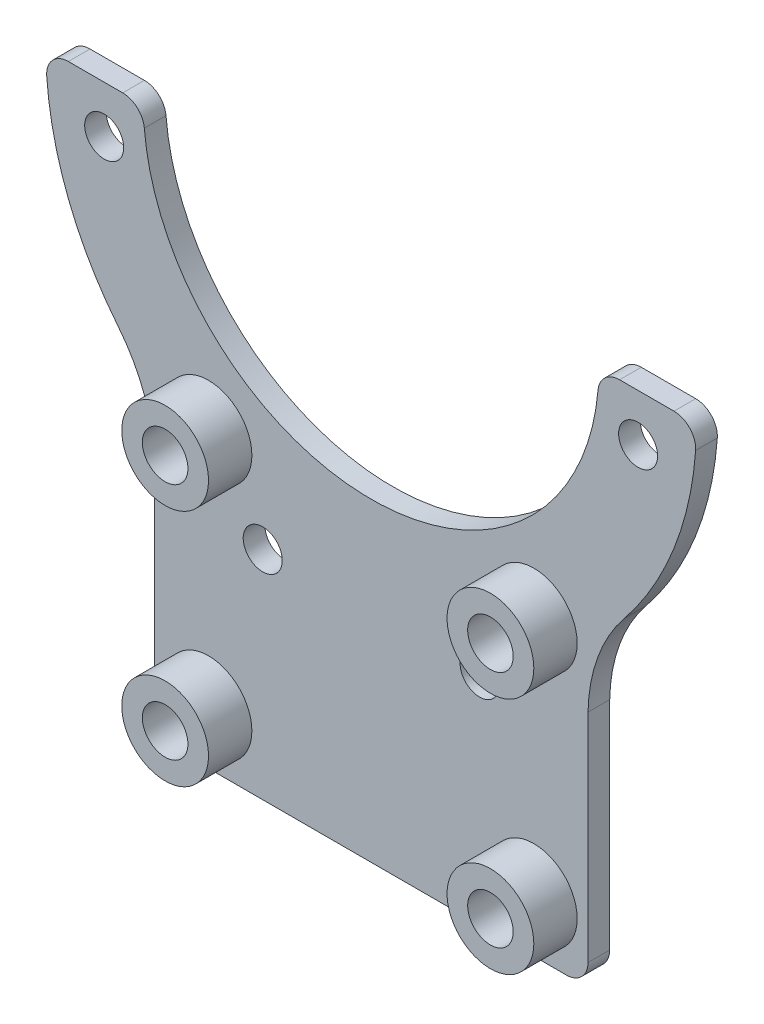
ISO-10303-21;
HEADER;
FILE_DESCRIPTION(('STEP AP214'),'2;1');
FILE_NAME('part.step','',(''),(''),'','','');
FILE_SCHEMA(('AUTOMOTIVE_DESIGN { 1 0 10303 214 1 1 1 1 }'));
ENDSEC;
DATA;
#1=APPLICATION_CONTEXT('core data for automotive mechanical design processes');
#2=APPLICATION_PROTOCOL_DEFINITION('international standard','automotive_design',2000,#1);
#3=PRODUCT_CONTEXT('',#1,'mechanical');
#4=PRODUCT('Part','Part','',(#3));
#5=PRODUCT_RELATED_PRODUCT_CATEGORY('part','',(#4));
#6=PRODUCT_DEFINITION_FORMATION('','',#4);
#7=PRODUCT_DEFINITION_CONTEXT('part definition',#1,'design');
#8=PRODUCT_DEFINITION('design','',#6,#7);
#9=PRODUCT_DEFINITION_SHAPE('','',#8);
#10=(LENGTH_UNIT() NAMED_UNIT(*) SI_UNIT(.MILLI.,.METRE.));
#11=(NAMED_UNIT(*) PLANE_ANGLE_UNIT() SI_UNIT($,.RADIAN.));
#12=(NAMED_UNIT(*) SI_UNIT($,.STERADIAN.) SOLID_ANGLE_UNIT());
#13=UNCERTAINTY_MEASURE_WITH_UNIT(LENGTH_MEASURE(1.E-05),#10,'distance_accuracy_value','');
#14=(GEOMETRIC_REPRESENTATION_CONTEXT(3) GLOBAL_UNCERTAINTY_ASSIGNED_CONTEXT((#13)) GLOBAL_UNIT_ASSIGNED_CONTEXT((#10,
#11,#12)) REPRESENTATION_CONTEXT('',''));
#15=CARTESIAN_POINT('',(0.,0.,0.));
#16=DIRECTION('',(0.,0.,1.));
#17=DIRECTION('',(1.,0.,0.));
#18=AXIS2_PLACEMENT_3D('',#15,#16,#17);
#19=CARTESIAN_POINT('',(0.,0.,2.));
#20=DIRECTION('',(0.,0.,-1.));
#21=DIRECTION('',(-1.,0.,0.));
#22=AXIS2_PLACEMENT_3D('',#19,#20,#21);
#23=CYLINDRICAL_SURFACE('',#22,30.);
#24=CARTESIAN_POINT('',(0.,0.,0.));
#25=DIRECTION('',(0.,0.,1.));
#26=DIRECTION('',(1.,0.,0.));
#27=AXIS2_PLACEMENT_3D('',#24,#25,#26);
#28=CIRCLE('',#27,30.);
#29=CARTESIAN_POINT('',(23.3314939938861,-18.8584566710337,0.));
#30=VERTEX_POINT('',#29);
#31=CARTESIAN_POINT('',(29.923371522362,-2.14285714285714,0.));
#32=VERTEX_POINT('',#31);
#33=EDGE_CURVE('E255',#30,#32,#28,.T.);
#34=ORIENTED_EDGE('',*,*,#33,.T.);
#35=DIRECTION('',(0.,0.,-1.));
#36=VECTOR('',#35,1.);
#37=CARTESIAN_POINT('',(29.923371522362,-2.14285714285714,2.));
#38=LINE('',#37,#36);
#39=CARTESIAN_POINT('',(29.923371522362,-2.14285714285714,2.));
#40=VERTEX_POINT('',#39);
#41=EDGE_CURVE('E223',#32,#40,#38,.F.);
#42=ORIENTED_EDGE('',*,*,#41,.T.);
#43=CARTESIAN_POINT('',(0.,0.,2.));
#44=DIRECTION('',(0.,0.,1.));
#45=DIRECTION('',(1.,0.,0.));
#46=AXIS2_PLACEMENT_3D('',#43,#44,#45);
#47=CIRCLE('',#46,30.);
#48=CARTESIAN_POINT('',(23.3314939938861,-18.8584566710337,2.));
#49=VERTEX_POINT('',#48);
#50=EDGE_CURVE('E276',#49,#40,#47,.T.);
#51=ORIENTED_EDGE('',*,*,#50,.F.);
#52=DIRECTION('',(0.,0.,-1.));
#53=VECTOR('',#52,1.);
#54=CARTESIAN_POINT('',(23.3314939938861,-18.8584566710337,2.));
#55=LINE('',#54,#53);
#56=EDGE_CURVE('E173',#49,#30,#55,.T.);
#57=ORIENTED_EDGE('',*,*,#56,.T.);
#58=EDGE_LOOP('',(#34,#42,#51,#57));
#59=FACE_BOUND('',#58,.T.);
#60=ADVANCED_FACE('F35',(#59),#23,.T.);
#61=CARTESIAN_POINT('',(0.,0.,2.));
#62=DIRECTION('',(0.,1.,0.));
#63=DIRECTION('',(0.,0.,1.));
#64=AXIS2_PLACEMENT_3D('',#61,#62,#63);
#65=PLANE('',#64);
#66=DIRECTION('',(1.,0.,0.));
#67=VECTOR('',#66,1.);
#68=CARTESIAN_POINT('',(0.,0.,2.));
#69=LINE('',#68,#67);
#70=CARTESIAN_POINT('',(22.9128784747792,0.,2.));
#71=VERTEX_POINT('',#70);
#72=CARTESIAN_POINT('',(27.9284800875379,0.,2.));
#73=VERTEX_POINT('',#72);
#74=EDGE_CURVE('E274',#71,#73,#69,.T.);
#75=ORIENTED_EDGE('',*,*,#74,.T.);
#76=DIRECTION('',(0.,0.,1.));
#77=VECTOR('',#76,1.);
#78=CARTESIAN_POINT('',(27.9284800875379,0.,0.));
#79=LINE('',#78,#77);
#80=CARTESIAN_POINT('',(27.9284800875379,0.,0.));
#81=VERTEX_POINT('',#80);
#82=EDGE_CURVE('E220',#73,#81,#79,.F.);
#83=ORIENTED_EDGE('',*,*,#82,.T.);
#84=DIRECTION('',(1.,0.,0.));
#85=VECTOR('',#84,1.);
#86=CARTESIAN_POINT('',(0.,0.,0.));
#87=LINE('',#86,#85);
#88=CARTESIAN_POINT('',(22.9128784747792,0.,0.));
#89=VERTEX_POINT('',#88);
#90=EDGE_CURVE('E252',#89,#81,#87,.T.);
#91=ORIENTED_EDGE('',*,*,#90,.F.);
#92=DIRECTION('',(0.,0.,-1.));
#93=VECTOR('',#92,1.);
#94=CARTESIAN_POINT('',(22.9128784747792,0.,2.));
#95=LINE('',#94,#93);
#96=EDGE_CURVE('E218',#89,#71,#95,.F.);
#97=ORIENTED_EDGE('',*,*,#96,.T.);
#98=EDGE_LOOP('',(#75,#83,#91,#97));
#99=FACE_BOUND('',#98,.T.);
#100=ADVANCED_FACE('F399',(#99),#65,.T.);
#101=CARTESIAN_POINT('',(0.,0.,2.));
#102=DIRECTION('',(0.,0.,-1.));
#103=DIRECTION('',(-1.,0.,0.));
#104=AXIS2_PLACEMENT_3D('',#101,#102,#103);
#105=CYLINDRICAL_SURFACE('',#104,21.);
#106=CARTESIAN_POINT('',(0.,0.,2.));
#107=DIRECTION('',(0.,0.,1.));
#108=DIRECTION('',(1.,0.,0.));
#109=AXIS2_PLACEMENT_3D('',#106,#107,#108);
#110=CIRCLE('',#109,21.);
#111=CARTESIAN_POINT('',(-20.920454259581,-1.82608695652174,2.));
#112=VERTEX_POINT('',#111);
#113=CARTESIAN_POINT('',(20.920454259581,-1.82608695652174,2.));
#114=VERTEX_POINT('',#113);
#115=EDGE_CURVE('E271',#112,#114,#110,.T.);
#116=ORIENTED_EDGE('',*,*,#115,.T.);
#117=DIRECTION('',(0.,0.,-1.));
#118=VECTOR('',#117,1.);
#119=CARTESIAN_POINT('',(20.920454259581,-1.82608695652174,2.));
#120=LINE('',#119,#118);
#121=CARTESIAN_POINT('',(20.920454259581,-1.82608695652174,0.));
#122=VERTEX_POINT('',#121);
#123=EDGE_CURVE('E227',#114,#122,#120,.T.);
#124=ORIENTED_EDGE('',*,*,#123,.T.);
#125=CARTESIAN_POINT('',(0.,0.,0.));
#126=DIRECTION('',(0.,0.,1.));
#127=DIRECTION('',(1.,0.,0.));
#128=AXIS2_PLACEMENT_3D('',#125,#126,#127);
#129=CIRCLE('',#128,21.);
#130=CARTESIAN_POINT('',(-20.920454259581,-1.82608695652174,0.));
#131=VERTEX_POINT('',#130);
#132=EDGE_CURVE('E250',#131,#122,#129,.T.);
#133=ORIENTED_EDGE('',*,*,#132,.F.);
#134=DIRECTION('',(0.,0.,-1.));
#135=VECTOR('',#134,1.);
#136=CARTESIAN_POINT('',(-20.920454259581,-1.82608695652174,2.));
#137=LINE('',#136,#135);
#138=EDGE_CURVE('E225',#131,#112,#137,.F.);
#139=ORIENTED_EDGE('',*,*,#138,.T.);
#140=EDGE_LOOP('',(#116,#124,#133,#139));
#141=FACE_BOUND('',#140,.T.);
#142=ADVANCED_FACE('F405',(#141),#105,.F.);
#143=CARTESIAN_POINT('',(-27.9284800875379,0.,2.));
#144=VERTEX_POINT('',#143);
#145=CARTESIAN_POINT('',(-22.9128784747792,0.,2.));
#146=VERTEX_POINT('',#145);
#147=EDGE_CURVE('E240',#144,#146,#69,.T.);
#148=ORIENTED_EDGE('',*,*,#147,.T.);
#149=DIRECTION('',(0.,0.,-1.));
#150=VECTOR('',#149,1.);
#151=CARTESIAN_POINT('',(-22.9128784747792,0.,2.));
#152=LINE('',#151,#150);
#153=CARTESIAN_POINT('',(-22.9128784747792,0.,0.));
#154=VERTEX_POINT('',#153);
#155=EDGE_CURVE('E43',#146,#154,#152,.T.);
#156=ORIENTED_EDGE('',*,*,#155,.T.);
#157=CARTESIAN_POINT('',(-27.9284800875379,0.,0.));
#158=VERTEX_POINT('',#157);
#159=EDGE_CURVE('E238',#158,#154,#87,.T.);
#160=ORIENTED_EDGE('',*,*,#159,.F.);
#161=DIRECTION('',(0.,0.,1.));
#162=VECTOR('',#161,1.);
#163=CARTESIAN_POINT('',(-27.9284800875379,0.,2.));
#164=LINE('',#163,#162);
#165=EDGE_CURVE('E230',#158,#144,#164,.T.);
#166=ORIENTED_EDGE('',*,*,#165,.T.);
#167=EDGE_LOOP('',(#148,#156,#160,#166));
#168=FACE_BOUND('',#167,.T.);
#169=ADVANCED_FACE('F237',(#168),#65,.T.);
#170=CARTESIAN_POINT('',(-29.923371522362,-2.14285714285714,2.));
#171=VERTEX_POINT('',#170);
#172=CARTESIAN_POINT('',(-23.3314939938861,-18.8584566710338,2.));
#173=VERTEX_POINT('',#172);
#174=EDGE_CURVE('E154',#171,#173,#47,.T.);
#175=ORIENTED_EDGE('',*,*,#174,.F.);
#176=DIRECTION('',(0.,0.,-1.));
#177=VECTOR('',#176,1.);
#178=CARTESIAN_POINT('',(-29.923371522362,-2.14285714285714,2.));
#179=LINE('',#178,#177);
#180=CARTESIAN_POINT('',(-29.923371522362,-2.14285714285714,0.));
#181=VERTEX_POINT('',#180);
#182=EDGE_CURVE('E11',#171,#181,#179,.T.);
#183=ORIENTED_EDGE('',*,*,#182,.T.);
#184=CARTESIAN_POINT('',(-23.3314939938861,-18.8584566710338,0.));
#185=VERTEX_POINT('',#184);
#186=EDGE_CURVE('E249',#181,#185,#28,.T.);
#187=ORIENTED_EDGE('',*,*,#186,.T.);
#188=DIRECTION('',(0.,0.,-1.));
#189=VECTOR('',#188,1.);
#190=CARTESIAN_POINT('',(-23.3314939938861,-18.8584566710338,2.));
#191=LINE('',#190,#189);
#192=EDGE_CURVE('E170',#185,#173,#191,.F.);
#193=ORIENTED_EDGE('',*,*,#192,.T.);
#194=EDGE_LOOP('',(#175,#183,#187,#193));
#195=FACE_BOUND('',#194,.T.);
#196=ADVANCED_FACE('F401',(#195),#23,.T.);
#197=CARTESIAN_POINT('',(-20.,0.,2.));
#198=DIRECTION('',(1.,0.,0.));
#199=DIRECTION('',(0.,0.,-1.));
#200=AXIS2_PLACEMENT_3D('',#197,#198,#199);
#201=PLANE('',#200);
#202=DIRECTION('',(0.,-1.,0.));
#203=VECTOR('',#202,1.);
#204=CARTESIAN_POINT('',(-20.,0.,0.));
#205=LINE('',#204,#203);
#206=CARTESIAN_POINT('',(-20.,-28.,0.));
#207=VERTEX_POINT('',#206);
#208=CARTESIAN_POINT('',(-20.,-48.,0.));
#209=VERTEX_POINT('',#208);
#210=EDGE_CURVE('E253',#207,#209,#205,.T.);
#211=ORIENTED_EDGE('',*,*,#210,.T.);
#212=DIRECTION('',(0.,0.,-1.));
#213=VECTOR('',#212,1.);
#214=CARTESIAN_POINT('',(-20.,-48.,2.));
#215=LINE('',#214,#213);
#216=CARTESIAN_POINT('',(-20.,-48.,2.));
#217=VERTEX_POINT('',#216);
#218=EDGE_CURVE('E50',#209,#217,#215,.F.);
#219=ORIENTED_EDGE('',*,*,#218,.T.);
#220=DIRECTION('',(0.,-1.,0.));
#221=VECTOR('',#220,1.);
#222=CARTESIAN_POINT('',(-20.,0.,2.));
#223=LINE('',#222,#221);
#224=CARTESIAN_POINT('',(-20.,-28.,2.));
#225=VERTEX_POINT('',#224);
#226=EDGE_CURVE('E152',#225,#217,#223,.T.);
#227=ORIENTED_EDGE('',*,*,#226,.F.);
#228=DIRECTION('',(0.,0.,-1.));
#229=VECTOR('',#228,1.);
#230=CARTESIAN_POINT('',(-20.,-28.,2.));
#231=LINE('',#230,#229);
#232=EDGE_CURVE('E164',#225,#207,#231,.T.);
#233=ORIENTED_EDGE('',*,*,#232,.T.);
#234=EDGE_LOOP('',(#211,#219,#227,#233));
#235=FACE_BOUND('',#234,.T.);
#236=ADVANCED_FACE('F163',(#235),#201,.F.);
#237=CARTESIAN_POINT('',(0.,-50.,2.));
#238=DIRECTION('',(0.,1.,0.));
#239=DIRECTION('',(0.,0.,1.));
#240=AXIS2_PLACEMENT_3D('',#237,#238,#239);
#241=PLANE('',#240);
#242=DIRECTION('',(1.,0.,0.));
#243=VECTOR('',#242,1.);
#244=CARTESIAN_POINT('',(0.,-50.,0.));
#245=LINE('',#244,#243);
#246=CARTESIAN_POINT('',(-18.,-50.,0.));
#247=VERTEX_POINT('',#246);
#248=CARTESIAN_POINT('',(18.,-50.,0.));
#249=VERTEX_POINT('',#248);
#250=EDGE_CURVE('E437',#247,#249,#245,.T.);
#251=ORIENTED_EDGE('',*,*,#250,.T.);
#252=DIRECTION('',(0.,0.,-1.));
#253=VECTOR('',#252,1.);
#254=CARTESIAN_POINT('',(18.,-50.,2.));
#255=LINE('',#254,#253);
#256=CARTESIAN_POINT('',(18.,-50.,2.));
#257=VERTEX_POINT('',#256);
#258=EDGE_CURVE('E204',#249,#257,#255,.F.);
#259=ORIENTED_EDGE('',*,*,#258,.T.);
#260=DIRECTION('',(1.,0.,0.));
#261=VECTOR('',#260,1.);
#262=CARTESIAN_POINT('',(0.,-50.,2.));
#263=LINE('',#262,#261);
#264=CARTESIAN_POINT('',(-18.,-50.,2.));
#265=VERTEX_POINT('',#264);
#266=EDGE_CURVE('E166',#265,#257,#263,.T.);
#267=ORIENTED_EDGE('',*,*,#266,.F.);
#268=DIRECTION('',(0.,0.,-1.));
#269=VECTOR('',#268,1.);
#270=CARTESIAN_POINT('',(-18.,-50.,2.));
#271=LINE('',#270,#269);
#272=EDGE_CURVE('E201',#265,#247,#271,.T.);
#273=ORIENTED_EDGE('',*,*,#272,.T.);
#274=EDGE_LOOP('',(#251,#259,#267,#273));
#275=FACE_BOUND('',#274,.T.);
#276=ADVANCED_FACE('F415',(#275),#241,.F.);
#277=CARTESIAN_POINT('',(20.,0.,2.));
#278=DIRECTION('',(1.,0.,0.));
#279=DIRECTION('',(0.,0.,-1.));
#280=AXIS2_PLACEMENT_3D('',#277,#278,#279);
#281=PLANE('',#280);
#282=DIRECTION('',(0.,-1.,0.));
#283=VECTOR('',#282,1.);
#284=CARTESIAN_POINT('',(20.,0.,2.));
#285=LINE('',#284,#283);
#286=CARTESIAN_POINT('',(20.,-28.,2.));
#287=VERTEX_POINT('',#286);
#288=CARTESIAN_POINT('',(20.,-48.,2.));
#289=VERTEX_POINT('',#288);
#290=EDGE_CURVE('E176',#287,#289,#285,.T.);
#291=ORIENTED_EDGE('',*,*,#290,.T.);
#292=DIRECTION('',(0.,0.,-1.));
#293=VECTOR('',#292,1.);
#294=CARTESIAN_POINT('',(20.,-48.,0.));
#295=LINE('',#294,#293);
#296=CARTESIAN_POINT('',(20.,-48.,0.));
#297=VERTEX_POINT('',#296);
#298=EDGE_CURVE('E186',#289,#297,#295,.T.);
#299=ORIENTED_EDGE('',*,*,#298,.T.);
#300=DIRECTION('',(0.,-1.,0.));
#301=VECTOR('',#300,1.);
#302=CARTESIAN_POINT('',(20.,0.,0.));
#303=LINE('',#302,#301);
#304=CARTESIAN_POINT('',(20.,-28.,0.));
#305=VERTEX_POINT('',#304);
#306=EDGE_CURVE('E278',#305,#297,#303,.T.);
#307=ORIENTED_EDGE('',*,*,#306,.F.);
#308=DIRECTION('',(0.,0.,-1.));
#309=VECTOR('',#308,1.);
#310=CARTESIAN_POINT('',(20.,-28.,2.));
#311=LINE('',#310,#309);
#312=EDGE_CURVE('E171',#287,#305,#311,.T.);
#313=ORIENTED_EDGE('',*,*,#312,.F.);
#314=EDGE_LOOP('',(#291,#299,#307,#313));
#315=FACE_BOUND('',#314,.T.);
#316=ADVANCED_FACE('F367',(#315),#281,.T.);
#317=CARTESIAN_POINT('',(0.,0.,2.));
#318=DIRECTION('',(0.,0.,1.));
#319=DIRECTION('',(1.,0.,0.));
#320=AXIS2_PLACEMENT_3D('',#317,#318,#319);
#321=PLANE('',#320);
#322=CARTESIAN_POINT('',(-15.,-23.,2.));
#323=DIRECTION('',(0.,0.,1.));
#324=DIRECTION('',(1.,0.,0.));
#325=AXIS2_PLACEMENT_3D('',#322,#323,#324);
#326=CIRCLE('',#325,4.);
#327=CARTESIAN_POINT('',(-11.,-23.,2.));
#328=VERTEX_POINT('',#327);
#329=EDGE_CURVE('E319',#328,#328,#326,.T.);
#330=ORIENTED_EDGE('',*,*,#329,.F.);
#331=EDGE_LOOP('',(#330));
#332=FACE_BOUND('',#331,.T.);
#333=CARTESIAN_POINT('',(15.,-23.,2.));
#334=DIRECTION('',(0.,0.,1.));
#335=DIRECTION('',(1.,0.,0.));
#336=AXIS2_PLACEMENT_3D('',#333,#334,#335);
#337=CIRCLE('',#336,4.);
#338=CARTESIAN_POINT('',(19.,-23.,2.));
#339=VERTEX_POINT('',#338);
#340=EDGE_CURVE('E313',#339,#339,#337,.T.);
#341=ORIENTED_EDGE('',*,*,#340,.F.);
#342=EDGE_LOOP('',(#341));
#343=FACE_BOUND('',#342,.T.);
#344=CARTESIAN_POINT('',(15.,-45.,2.));
#345=DIRECTION('',(0.,0.,1.));
#346=DIRECTION('',(1.,0.,0.));
#347=AXIS2_PLACEMENT_3D('',#344,#345,#346);
#348=CIRCLE('',#347,4.);
#349=CARTESIAN_POINT('',(19.,-45.,2.));
#350=VERTEX_POINT('',#349);
#351=EDGE_CURVE('E307',#350,#350,#348,.T.);
#352=ORIENTED_EDGE('',*,*,#351,.F.);
#353=EDGE_LOOP('',(#352));
#354=FACE_BOUND('',#353,.T.);
#355=CARTESIAN_POINT('',(-15.,-45.,2.));
#356=DIRECTION('',(0.,0.,1.));
#357=DIRECTION('',(1.,0.,0.));
#358=AXIS2_PLACEMENT_3D('',#355,#356,#357);
#359=CIRCLE('',#358,4.);
#360=CARTESIAN_POINT('',(-11.,-45.,2.));
#361=VERTEX_POINT('',#360);
#362=EDGE_CURVE('E301',#361,#361,#359,.T.);
#363=ORIENTED_EDGE('',*,*,#362,.F.);
#364=EDGE_LOOP('',(#363));
#365=FACE_BOUND('',#364,.T.);
#366=CARTESIAN_POINT('',(-24.6201938253052,-4.34120444167328,2.));
#367=DIRECTION('',(0.,0.,1.));
#368=DIRECTION('',(1.,0.,0.));
#369=AXIS2_PLACEMENT_3D('',#366,#367,#368);
#370=CIRCLE('',#369,1.8);
#371=CARTESIAN_POINT('',(-22.8201938253052,-4.34120444167328,2.));
#372=VERTEX_POINT('',#371);
#373=EDGE_CURVE('E297',#372,#372,#370,.T.);
#374=ORIENTED_EDGE('',*,*,#373,.F.);
#375=EDGE_LOOP('',(#374));
#376=FACE_BOUND('',#375,.T.);
#377=CARTESIAN_POINT('',(-10.,-30.,2.));
#378=DIRECTION('',(0.,0.,1.));
#379=DIRECTION('',(1.,0.,0.));
#380=AXIS2_PLACEMENT_3D('',#377,#378,#379);
#381=CIRCLE('',#380,1.8);
#382=CARTESIAN_POINT('',(-8.2,-30.,2.));
#383=VERTEX_POINT('',#382);
#384=EDGE_CURVE('E291',#383,#383,#381,.T.);
#385=ORIENTED_EDGE('',*,*,#384,.F.);
#386=EDGE_LOOP('',(#385));
#387=FACE_BOUND('',#386,.T.);
#388=CARTESIAN_POINT('',(24.6201938253052,-4.34120444167328,2.));
#389=DIRECTION('',(0.,0.,1.));
#390=DIRECTION('',(1.,0.,0.));
#391=AXIS2_PLACEMENT_3D('',#388,#389,#390);
#392=CIRCLE('',#391,1.8);
#393=CARTESIAN_POINT('',(26.4201938253052,-4.34120444167328,2.));
#394=VERTEX_POINT('',#393);
#395=EDGE_CURVE('E285',#394,#394,#392,.T.);
#396=ORIENTED_EDGE('',*,*,#395,.F.);
#397=EDGE_LOOP('',(#396));
#398=FACE_BOUND('',#397,.T.);
#399=CARTESIAN_POINT('',(10.,-30.,2.));
#400=DIRECTION('',(0.,0.,1.));
#401=DIRECTION('',(1.,0.,0.));
#402=AXIS2_PLACEMENT_3D('',#399,#400,#401);
#403=CIRCLE('',#402,1.8);
#404=CARTESIAN_POINT('',(11.8,-30.,2.));
#405=VERTEX_POINT('',#404);
#406=EDGE_CURVE('E265',#405,#405,#403,.T.);
#407=ORIENTED_EDGE('',*,*,#406,.F.);
#408=EDGE_LOOP('',(#407));
#409=FACE_BOUND('',#408,.T.);
#410=ORIENTED_EDGE('',*,*,#266,.T.);
#411=CARTESIAN_POINT('',(18.,-48.,2.));
#412=DIRECTION('',(0.,0.,1.));
#413=DIRECTION('',(1.,0.,0.));
#414=AXIS2_PLACEMENT_3D('',#411,#412,#413);
#415=CIRCLE('',#414,2.);
#416=EDGE_CURVE('E215',#257,#289,#415,.T.);
#417=ORIENTED_EDGE('',*,*,#416,.T.);
#418=ORIENTED_EDGE('',*,*,#290,.F.);
#419=CARTESIAN_POINT('',(34.9972409908291,-28.2876850065506,2.));
#420=DIRECTION('',(0.,0.,1.));
#421=DIRECTION('',(1.,0.,0.));
#422=AXIS2_PLACEMENT_3D('',#419,#420,#421);
#423=CIRCLE('',#422,15.);
#424=EDGE_CURVE('E184',#287,#49,#423,.F.);
#425=ORIENTED_EDGE('',*,*,#424,.T.);
#426=ORIENTED_EDGE('',*,*,#50,.T.);
#427=CARTESIAN_POINT('',(27.9284800875379,-2.,2.));
#428=DIRECTION('',(0.,0.,1.));
#429=DIRECTION('',(1.,0.,0.));
#430=AXIS2_PLACEMENT_3D('',#427,#428,#429);
#431=CIRCLE('',#430,2.);
#432=EDGE_CURVE('E211',#40,#73,#431,.T.);
#433=ORIENTED_EDGE('',*,*,#432,.T.);
#434=ORIENTED_EDGE('',*,*,#74,.F.);
#435=CARTESIAN_POINT('',(22.9128784747792,-2.,2.));
#436=DIRECTION('',(0.,0.,1.));
#437=DIRECTION('',(1.,0.,0.));
#438=AXIS2_PLACEMENT_3D('',#435,#436,#437);
#439=CIRCLE('',#438,2.);
#440=EDGE_CURVE('E209',#71,#114,#439,.T.);
#441=ORIENTED_EDGE('',*,*,#440,.T.);
#442=ORIENTED_EDGE('',*,*,#115,.F.);
#443=CARTESIAN_POINT('',(-22.9128784747792,-2.,2.));
#444=DIRECTION('',(0.,0.,1.));
#445=DIRECTION('',(1.,0.,0.));
#446=AXIS2_PLACEMENT_3D('',#443,#444,#445);
#447=CIRCLE('',#446,2.);
#448=EDGE_CURVE('E207',#112,#146,#447,.T.);
#449=ORIENTED_EDGE('',*,*,#448,.T.);
#450=ORIENTED_EDGE('',*,*,#147,.F.);
#451=CARTESIAN_POINT('',(-27.9284800875379,-2.,2.));
#452=DIRECTION('',(0.,0.,1.));
#453=DIRECTION('',(1.,0.,0.));
#454=AXIS2_PLACEMENT_3D('',#451,#452,#453);
#455=CIRCLE('',#454,2.);
#456=EDGE_CURVE('E58',#144,#171,#455,.T.);
#457=ORIENTED_EDGE('',*,*,#456,.T.);
#458=ORIENTED_EDGE('',*,*,#174,.T.);
#459=CARTESIAN_POINT('',(-34.9972409908291,-28.2876850065506,2.));
#460=DIRECTION('',(0.,0.,1.));
#461=DIRECTION('',(1.,0.,0.));
#462=AXIS2_PLACEMENT_3D('',#459,#460,#461);
#463=CIRCLE('',#462,15.);
#464=EDGE_CURVE('E149',#173,#225,#463,.F.);
#465=ORIENTED_EDGE('',*,*,#464,.T.);
#466=ORIENTED_EDGE('',*,*,#226,.T.);
#467=CARTESIAN_POINT('',(-18.,-48.,2.));
#468=DIRECTION('',(0.,0.,1.));
#469=DIRECTION('',(1.,0.,0.));
#470=AXIS2_PLACEMENT_3D('',#467,#468,#469);
#471=CIRCLE('',#470,2.);
#472=EDGE_CURVE('E213',#217,#265,#471,.T.);
#473=ORIENTED_EDGE('',*,*,#472,.T.);
#474=EDGE_LOOP('',(#410,#417,#418,#425,#426,#433,#434,#441,#442,#449,#450,#457,#458,#465,#466,#473));
#475=FACE_BOUND('',#474,.T.);
#476=ADVANCED_FACE('F151',(#332,#343,#354,#365,#376,#387,#398,#409,#475),#321,.T.);
#477=CARTESIAN_POINT('',(0.,0.,0.));
#478=DIRECTION('',(0.,0.,1.));
#479=DIRECTION('',(1.,0.,0.));
#480=AXIS2_PLACEMENT_3D('',#477,#478,#479);
#481=PLANE('',#480);
#482=CARTESIAN_POINT('',(-15.,-23.,0.));
#483=DIRECTION('',(0.,0.,1.));
#484=DIRECTION('',(1.,0.,0.));
#485=AXIS2_PLACEMENT_3D('',#482,#483,#484);
#486=CIRCLE('',#485,2.1);
#487=CARTESIAN_POINT('',(-12.9,-23.,0.));
#488=VERTEX_POINT('',#487);
#489=EDGE_CURVE('E342',#488,#488,#486,.T.);
#490=ORIENTED_EDGE('',*,*,#489,.T.);
#491=EDGE_LOOP('',(#490));
#492=FACE_BOUND('',#491,.T.);
#493=CARTESIAN_POINT('',(15.,-23.,0.));
#494=DIRECTION('',(0.,0.,1.));
#495=DIRECTION('',(1.,0.,0.));
#496=AXIS2_PLACEMENT_3D('',#493,#494,#495);
#497=CIRCLE('',#496,2.1);
#498=CARTESIAN_POINT('',(17.1,-23.,0.));
#499=VERTEX_POINT('',#498);
#500=EDGE_CURVE('E336',#499,#499,#497,.T.);
#501=ORIENTED_EDGE('',*,*,#500,.T.);
#502=EDGE_LOOP('',(#501));
#503=FACE_BOUND('',#502,.T.);
#504=CARTESIAN_POINT('',(15.,-45.,0.));
#505=DIRECTION('',(0.,0.,1.));
#506=DIRECTION('',(1.,0.,0.));
#507=AXIS2_PLACEMENT_3D('',#504,#505,#506);
#508=CIRCLE('',#507,2.1);
#509=CARTESIAN_POINT('',(17.1,-45.,0.));
#510=VERTEX_POINT('',#509);
#511=EDGE_CURVE('E330',#510,#510,#508,.T.);
#512=ORIENTED_EDGE('',*,*,#511,.T.);
#513=EDGE_LOOP('',(#512));
#514=FACE_BOUND('',#513,.T.);
#515=CARTESIAN_POINT('',(-15.,-45.,0.));
#516=DIRECTION('',(0.,0.,1.));
#517=DIRECTION('',(1.,0.,0.));
#518=AXIS2_PLACEMENT_3D('',#515,#516,#517);
#519=CIRCLE('',#518,2.1);
#520=CARTESIAN_POINT('',(-12.9,-45.,0.));
#521=VERTEX_POINT('',#520);
#522=EDGE_CURVE('E322',#521,#521,#519,.T.);
#523=ORIENTED_EDGE('',*,*,#522,.T.);
#524=EDGE_LOOP('',(#523));
#525=FACE_BOUND('',#524,.T.);
#526=CARTESIAN_POINT('',(-24.6201938253052,-4.34120444167328,0.));
#527=DIRECTION('',(0.,0.,1.));
#528=DIRECTION('',(1.,0.,0.));
#529=AXIS2_PLACEMENT_3D('',#526,#527,#528);
#530=CIRCLE('',#529,1.8);
#531=CARTESIAN_POINT('',(-22.8201938253052,-4.34120444167328,0.));
#532=VERTEX_POINT('',#531);
#533=EDGE_CURVE('E294',#532,#532,#530,.T.);
#534=ORIENTED_EDGE('',*,*,#533,.T.);
#535=EDGE_LOOP('',(#534));
#536=FACE_BOUND('',#535,.T.);
#537=CARTESIAN_POINT('',(-10.,-30.,0.));
#538=DIRECTION('',(0.,0.,1.));
#539=DIRECTION('',(1.,0.,0.));
#540=AXIS2_PLACEMENT_3D('',#537,#538,#539);
#541=CIRCLE('',#540,1.8);
#542=CARTESIAN_POINT('',(-8.2,-30.,0.));
#543=VERTEX_POINT('',#542);
#544=EDGE_CURVE('E288',#543,#543,#541,.T.);
#545=ORIENTED_EDGE('',*,*,#544,.T.);
#546=EDGE_LOOP('',(#545));
#547=FACE_BOUND('',#546,.T.);
#548=CARTESIAN_POINT('',(24.6201938253052,-4.34120444167328,0.));
#549=DIRECTION('',(0.,0.,1.));
#550=DIRECTION('',(1.,0.,0.));
#551=AXIS2_PLACEMENT_3D('',#548,#549,#550);
#552=CIRCLE('',#551,1.8);
#553=CARTESIAN_POINT('',(26.4201938253052,-4.34120444167328,0.));
#554=VERTEX_POINT('',#553);
#555=EDGE_CURVE('E282',#554,#554,#552,.T.);
#556=ORIENTED_EDGE('',*,*,#555,.T.);
#557=EDGE_LOOP('',(#556));
#558=FACE_BOUND('',#557,.T.);
#559=CARTESIAN_POINT('',(10.,-30.,0.));
#560=DIRECTION('',(0.,0.,1.));
#561=DIRECTION('',(1.,0.,0.));
#562=AXIS2_PLACEMENT_3D('',#559,#560,#561);
#563=CIRCLE('',#562,1.8);
#564=CARTESIAN_POINT('',(11.8,-30.,0.));
#565=VERTEX_POINT('',#564);
#566=EDGE_CURVE('E260',#565,#565,#563,.T.);
#567=ORIENTED_EDGE('',*,*,#566,.T.);
#568=EDGE_LOOP('',(#567));
#569=FACE_BOUND('',#568,.T.);
#570=ORIENTED_EDGE('',*,*,#306,.T.);
#571=CARTESIAN_POINT('',(18.,-48.,0.));
#572=DIRECTION('',(0.,0.,1.));
#573=DIRECTION('',(1.,0.,0.));
#574=AXIS2_PLACEMENT_3D('',#571,#572,#573);
#575=CIRCLE('',#574,2.);
#576=EDGE_CURVE('E199',#297,#249,#575,.F.);
#577=ORIENTED_EDGE('',*,*,#576,.T.);
#578=ORIENTED_EDGE('',*,*,#250,.F.);
#579=CARTESIAN_POINT('',(-18.,-48.,0.));
#580=DIRECTION('',(0.,0.,1.));
#581=DIRECTION('',(1.,0.,0.));
#582=AXIS2_PLACEMENT_3D('',#579,#580,#581);
#583=CIRCLE('',#582,2.);
#584=EDGE_CURVE('E197',#247,#209,#583,.F.);
#585=ORIENTED_EDGE('',*,*,#584,.T.);
#586=ORIENTED_EDGE('',*,*,#210,.F.);
#587=CARTESIAN_POINT('',(-34.9972409908291,-28.2876850065506,0.));
#588=DIRECTION('',(0.,0.,1.));
#589=DIRECTION('',(1.,0.,0.));
#590=AXIS2_PLACEMENT_3D('',#587,#588,#589);
#591=CIRCLE('',#590,15.);
#592=EDGE_CURVE('E160',#207,#185,#591,.T.);
#593=ORIENTED_EDGE('',*,*,#592,.T.);
#594=ORIENTED_EDGE('',*,*,#186,.F.);
#595=CARTESIAN_POINT('',(-27.9284800875379,-2.,0.));
#596=DIRECTION('',(0.,0.,1.));
#597=DIRECTION('',(1.,0.,0.));
#598=AXIS2_PLACEMENT_3D('',#595,#596,#597);
#599=CIRCLE('',#598,2.);
#600=EDGE_CURVE('E189',#181,#158,#599,.F.);
#601=ORIENTED_EDGE('',*,*,#600,.T.);
#602=ORIENTED_EDGE('',*,*,#159,.T.);
#603=CARTESIAN_POINT('',(-22.9128784747792,-2.,0.));
#604=DIRECTION('',(0.,0.,1.));
#605=DIRECTION('',(1.,0.,0.));
#606=AXIS2_PLACEMENT_3D('',#603,#604,#605);
#607=CIRCLE('',#606,2.);
#608=EDGE_CURVE('E191',#154,#131,#607,.F.);
#609=ORIENTED_EDGE('',*,*,#608,.T.);
#610=ORIENTED_EDGE('',*,*,#132,.T.);
#611=CARTESIAN_POINT('',(22.9128784747792,-2.,0.));
#612=DIRECTION('',(0.,0.,1.));
#613=DIRECTION('',(1.,0.,0.));
#614=AXIS2_PLACEMENT_3D('',#611,#612,#613);
#615=CIRCLE('',#614,2.);
#616=EDGE_CURVE('E193',#122,#89,#615,.F.);
#617=ORIENTED_EDGE('',*,*,#616,.T.);
#618=ORIENTED_EDGE('',*,*,#90,.T.);
#619=CARTESIAN_POINT('',(27.9284800875379,-2.,0.));
#620=DIRECTION('',(0.,0.,1.));
#621=DIRECTION('',(1.,0.,0.));
#622=AXIS2_PLACEMENT_3D('',#619,#620,#621);
#623=CIRCLE('',#622,2.);
#624=EDGE_CURVE('E195',#81,#32,#623,.F.);
#625=ORIENTED_EDGE('',*,*,#624,.T.);
#626=ORIENTED_EDGE('',*,*,#33,.F.);
#627=CARTESIAN_POINT('',(34.9972409908291,-28.2876850065506,0.));
#628=DIRECTION('',(0.,0.,1.));
#629=DIRECTION('',(1.,0.,0.));
#630=AXIS2_PLACEMENT_3D('',#627,#628,#629);
#631=CIRCLE('',#630,15.);
#632=EDGE_CURVE('E159',#30,#305,#631,.T.);
#633=ORIENTED_EDGE('',*,*,#632,.T.);
#634=EDGE_LOOP('',(#570,#577,#578,#585,#586,#593,#594,#601,#602,#609,#610,#617,#618,#625,#626,#633));
#635=FACE_BOUND('',#634,.T.);
#636=ADVANCED_FACE('F245',(#492,#503,#514,#525,#536,#547,#558,#569,#635),#481,.F.);
#637=CARTESIAN_POINT('',(-34.9972409908291,-28.2876850065506,2.));
#638=DIRECTION('',(0.,0.,1.));
#639=DIRECTION('',(1.,0.,0.));
#640=AXIS2_PLACEMENT_3D('',#637,#638,#639);
#641=CYLINDRICAL_SURFACE('',#640,15.);
#642=ORIENTED_EDGE('',*,*,#464,.F.);
#643=ORIENTED_EDGE('',*,*,#192,.F.);
#644=ORIENTED_EDGE('',*,*,#592,.F.);
#645=ORIENTED_EDGE('',*,*,#232,.F.);
#646=EDGE_LOOP('',(#642,#643,#644,#645));
#647=FACE_BOUND('',#646,.T.);
#648=ADVANCED_FACE('F168',(#647),#641,.F.);
#649=CARTESIAN_POINT('',(34.9972409908291,-28.2876850065506,2.));
#650=DIRECTION('',(0.,0.,1.));
#651=DIRECTION('',(1.,0.,0.));
#652=AXIS2_PLACEMENT_3D('',#649,#650,#651);
#653=CYLINDRICAL_SURFACE('',#652,15.);
#654=ORIENTED_EDGE('',*,*,#424,.F.);
#655=ORIENTED_EDGE('',*,*,#312,.T.);
#656=ORIENTED_EDGE('',*,*,#632,.F.);
#657=ORIENTED_EDGE('',*,*,#56,.F.);
#658=EDGE_LOOP('',(#654,#655,#656,#657));
#659=FACE_BOUND('',#658,.T.);
#660=ADVANCED_FACE('F439',(#659),#653,.F.);
#661=CARTESIAN_POINT('',(18.,-48.,2.));
#662=DIRECTION('',(0.,0.,1.));
#663=DIRECTION('',(1.,0.,0.));
#664=AXIS2_PLACEMENT_3D('',#661,#662,#663);
#665=CYLINDRICAL_SURFACE('',#664,2.);
#666=ORIENTED_EDGE('',*,*,#416,.F.);
#667=ORIENTED_EDGE('',*,*,#258,.F.);
#668=ORIENTED_EDGE('',*,*,#576,.F.);
#669=ORIENTED_EDGE('',*,*,#298,.F.);
#670=EDGE_LOOP('',(#666,#667,#668,#669));
#671=FACE_BOUND('',#670,.T.);
#672=ADVANCED_FACE('F443',(#671),#665,.T.);
#673=CARTESIAN_POINT('',(-18.,-48.,2.));
#674=DIRECTION('',(0.,0.,-1.));
#675=DIRECTION('',(-1.,0.,0.));
#676=AXIS2_PLACEMENT_3D('',#673,#674,#675);
#677=CYLINDRICAL_SURFACE('',#676,2.);
#678=ORIENTED_EDGE('',*,*,#472,.F.);
#679=ORIENTED_EDGE('',*,*,#218,.F.);
#680=ORIENTED_EDGE('',*,*,#584,.F.);
#681=ORIENTED_EDGE('',*,*,#272,.F.);
#682=EDGE_LOOP('',(#678,#679,#680,#681));
#683=FACE_BOUND('',#682,.T.);
#684=ADVANCED_FACE('F453',(#683),#677,.T.);
#685=CARTESIAN_POINT('',(27.9284800875379,-2.,2.));
#686=DIRECTION('',(0.,0.,-1.));
#687=DIRECTION('',(-1.,0.,0.));
#688=AXIS2_PLACEMENT_3D('',#685,#686,#687);
#689=CYLINDRICAL_SURFACE('',#688,2.);
#690=ORIENTED_EDGE('',*,*,#432,.F.);
#691=ORIENTED_EDGE('',*,*,#41,.F.);
#692=ORIENTED_EDGE('',*,*,#624,.F.);
#693=ORIENTED_EDGE('',*,*,#82,.F.);
#694=EDGE_LOOP('',(#690,#691,#692,#693));
#695=FACE_BOUND('',#694,.T.);
#696=ADVANCED_FACE('F430',(#695),#689,.T.);
#697=CARTESIAN_POINT('',(22.9128784747792,-2.,2.));
#698=DIRECTION('',(0.,0.,-1.));
#699=DIRECTION('',(-1.,0.,0.));
#700=AXIS2_PLACEMENT_3D('',#697,#698,#699);
#701=CYLINDRICAL_SURFACE('',#700,2.);
#702=ORIENTED_EDGE('',*,*,#440,.F.);
#703=ORIENTED_EDGE('',*,*,#96,.F.);
#704=ORIENTED_EDGE('',*,*,#616,.F.);
#705=ORIENTED_EDGE('',*,*,#123,.F.);
#706=EDGE_LOOP('',(#702,#703,#704,#705));
#707=FACE_BOUND('',#706,.T.);
#708=ADVANCED_FACE('F427',(#707),#701,.T.);
#709=CARTESIAN_POINT('',(-22.9128784747792,-2.,2.));
#710=DIRECTION('',(0.,0.,-1.));
#711=DIRECTION('',(-1.,0.,0.));
#712=AXIS2_PLACEMENT_3D('',#709,#710,#711);
#713=CYLINDRICAL_SURFACE('',#712,2.);
#714=ORIENTED_EDGE('',*,*,#448,.F.);
#715=ORIENTED_EDGE('',*,*,#138,.F.);
#716=ORIENTED_EDGE('',*,*,#608,.F.);
#717=ORIENTED_EDGE('',*,*,#155,.F.);
#718=EDGE_LOOP('',(#714,#715,#716,#717));
#719=FACE_BOUND('',#718,.T.);
#720=ADVANCED_FACE('F395',(#719),#713,.T.);
#721=CARTESIAN_POINT('',(-27.9284800875379,-2.,2.));
#722=DIRECTION('',(0.,0.,-1.));
#723=DIRECTION('',(-1.,0.,0.));
#724=AXIS2_PLACEMENT_3D('',#721,#722,#723);
#725=CYLINDRICAL_SURFACE('',#724,2.);
#726=ORIENTED_EDGE('',*,*,#456,.F.);
#727=ORIENTED_EDGE('',*,*,#165,.F.);
#728=ORIENTED_EDGE('',*,*,#600,.F.);
#729=ORIENTED_EDGE('',*,*,#182,.F.);
#730=EDGE_LOOP('',(#726,#727,#728,#729));
#731=FACE_BOUND('',#730,.T.);
#732=ADVANCED_FACE('F37',(#731),#725,.T.);
#733=CARTESIAN_POINT('',(10.,-30.,2.));
#734=DIRECTION('',(0.,0.,1.));
#735=DIRECTION('',(1.,0.,0.));
#736=AXIS2_PLACEMENT_3D('',#733,#734,#735);
#737=CYLINDRICAL_SURFACE('',#736,1.8);
#738=ORIENTED_EDGE('',*,*,#566,.F.);
#739=EDGE_LOOP('',(#738));
#740=FACE_BOUND('',#739,.T.);
#741=ORIENTED_EDGE('',*,*,#406,.T.);
#742=EDGE_LOOP('',(#741));
#743=FACE_BOUND('',#742,.T.);
#744=ADVANCED_FACE('F383',(#740,#743),#737,.F.);
#745=CARTESIAN_POINT('',(24.6201938253052,-4.34120444167328,2.));
#746=DIRECTION('',(0.,0.,1.));
#747=DIRECTION('',(1.,0.,0.));
#748=AXIS2_PLACEMENT_3D('',#745,#746,#747);
#749=CYLINDRICAL_SURFACE('',#748,1.8);
#750=ORIENTED_EDGE('',*,*,#555,.F.);
#751=EDGE_LOOP('',(#750));
#752=FACE_BOUND('',#751,.T.);
#753=ORIENTED_EDGE('',*,*,#395,.T.);
#754=EDGE_LOOP('',(#753));
#755=FACE_BOUND('',#754,.T.);
#756=ADVANCED_FACE('F385',(#752,#755),#749,.F.);
#757=CARTESIAN_POINT('',(-10.,-30.,2.));
#758=DIRECTION('',(0.,0.,1.));
#759=DIRECTION('',(1.,0.,0.));
#760=AXIS2_PLACEMENT_3D('',#757,#758,#759);
#761=CYLINDRICAL_SURFACE('',#760,1.8);
#762=ORIENTED_EDGE('',*,*,#544,.F.);
#763=EDGE_LOOP('',(#762));
#764=FACE_BOUND('',#763,.T.);
#765=ORIENTED_EDGE('',*,*,#384,.T.);
#766=EDGE_LOOP('',(#765));
#767=FACE_BOUND('',#766,.T.);
#768=ADVANCED_FACE('F392',(#764,#767),#761,.F.);
#769=CARTESIAN_POINT('',(-24.6201938253052,-4.34120444167328,2.));
#770=DIRECTION('',(0.,0.,1.));
#771=DIRECTION('',(1.,0.,0.));
#772=AXIS2_PLACEMENT_3D('',#769,#770,#771);
#773=CYLINDRICAL_SURFACE('',#772,1.8);
#774=ORIENTED_EDGE('',*,*,#533,.F.);
#775=EDGE_LOOP('',(#774));
#776=FACE_BOUND('',#775,.T.);
#777=ORIENTED_EDGE('',*,*,#373,.T.);
#778=EDGE_LOOP('',(#777));
#779=FACE_BOUND('',#778,.T.);
#780=ADVANCED_FACE('F493',(#776,#779),#773,.F.);
#781=CARTESIAN_POINT('',(-15.,-45.,6.));
#782=DIRECTION('',(0.,0.,-1.));
#783=DIRECTION('',(-1.,0.,0.));
#784=AXIS2_PLACEMENT_3D('',#781,#782,#783);
#785=CYLINDRICAL_SURFACE('',#784,4.);
#786=CARTESIAN_POINT('',(-15.,-45.,6.));
#787=DIRECTION('',(0.,0.,1.));
#788=DIRECTION('',(1.,0.,0.));
#789=AXIS2_PLACEMENT_3D('',#786,#787,#788);
#790=CIRCLE('',#789,4.);
#791=CARTESIAN_POINT('',(-11.,-45.,6.));
#792=VERTEX_POINT('',#791);
#793=EDGE_CURVE('E300',#792,#792,#790,.T.);
#794=ORIENTED_EDGE('',*,*,#793,.F.);
#795=EDGE_LOOP('',(#794));
#796=FACE_BOUND('',#795,.T.);
#797=ORIENTED_EDGE('',*,*,#362,.T.);
#798=EDGE_LOOP('',(#797));
#799=FACE_BOUND('',#798,.T.);
#800=ADVANCED_FACE('F503',(#796,#799),#785,.T.);
#801=CARTESIAN_POINT('',(-15.,-45.,6.));
#802=DIRECTION('',(0.,0.,1.));
#803=DIRECTION('',(1.,0.,0.));
#804=AXIS2_PLACEMENT_3D('',#801,#802,#803);
#805=PLANE('',#804);
#806=CARTESIAN_POINT('',(-15.,-45.,6.));
#807=DIRECTION('',(0.,0.,1.));
#808=DIRECTION('',(1.,0.,0.));
#809=AXIS2_PLACEMENT_3D('',#806,#807,#808);
#810=CIRCLE('',#809,2.09999999999999);
#811=CARTESIAN_POINT('',(-12.9,-45.,6.));
#812=VERTEX_POINT('',#811);
#813=EDGE_CURVE('E327',#812,#812,#810,.T.);
#814=ORIENTED_EDGE('',*,*,#813,.F.);
#815=EDGE_LOOP('',(#814));
#816=FACE_BOUND('',#815,.T.);
#817=ORIENTED_EDGE('',*,*,#793,.T.);
#818=EDGE_LOOP('',(#817));
#819=FACE_BOUND('',#818,.T.);
#820=ADVANCED_FACE('F523',(#816,#819),#805,.T.);
#821=CARTESIAN_POINT('',(15.,-45.,6.));
#822=DIRECTION('',(0.,0.,-1.));
#823=DIRECTION('',(-1.,0.,0.));
#824=AXIS2_PLACEMENT_3D('',#821,#822,#823);
#825=CYLINDRICAL_SURFACE('',#824,4.);
#826=CARTESIAN_POINT('',(15.,-45.,6.));
#827=DIRECTION('',(0.,0.,1.));
#828=DIRECTION('',(1.,0.,0.));
#829=AXIS2_PLACEMENT_3D('',#826,#827,#828);
#830=CIRCLE('',#829,4.);
#831=CARTESIAN_POINT('',(19.,-45.,6.));
#832=VERTEX_POINT('',#831);
#833=EDGE_CURVE('E304',#832,#832,#830,.T.);
#834=ORIENTED_EDGE('',*,*,#833,.F.);
#835=EDGE_LOOP('',(#834));
#836=FACE_BOUND('',#835,.T.);
#837=ORIENTED_EDGE('',*,*,#351,.T.);
#838=EDGE_LOOP('',(#837));
#839=FACE_BOUND('',#838,.T.);
#840=ADVANCED_FACE('F531',(#836,#839),#825,.T.);
#841=CARTESIAN_POINT('',(15.,-45.,6.));
#842=DIRECTION('',(0.,0.,1.));
#843=DIRECTION('',(1.,0.,0.));
#844=AXIS2_PLACEMENT_3D('',#841,#842,#843);
#845=PLANE('',#844);
#846=CARTESIAN_POINT('',(15.,-45.,6.));
#847=DIRECTION('',(0.,0.,1.));
#848=DIRECTION('',(1.,0.,0.));
#849=AXIS2_PLACEMENT_3D('',#846,#847,#848);
#850=CIRCLE('',#849,2.09999999999999);
#851=CARTESIAN_POINT('',(17.1,-45.,6.));
#852=VERTEX_POINT('',#851);
#853=EDGE_CURVE('E333',#852,#852,#850,.T.);
#854=ORIENTED_EDGE('',*,*,#853,.F.);
#855=EDGE_LOOP('',(#854));
#856=FACE_BOUND('',#855,.T.);
#857=ORIENTED_EDGE('',*,*,#833,.T.);
#858=EDGE_LOOP('',(#857));
#859=FACE_BOUND('',#858,.T.);
#860=ADVANCED_FACE('F536',(#856,#859),#845,.T.);
#861=CARTESIAN_POINT('',(15.,-23.,6.));
#862=DIRECTION('',(0.,0.,-1.));
#863=DIRECTION('',(-1.,0.,0.));
#864=AXIS2_PLACEMENT_3D('',#861,#862,#863);
#865=CYLINDRICAL_SURFACE('',#864,4.);
#866=CARTESIAN_POINT('',(15.,-23.,6.));
#867=DIRECTION('',(0.,0.,1.));
#868=DIRECTION('',(1.,0.,0.));
#869=AXIS2_PLACEMENT_3D('',#866,#867,#868);
#870=CIRCLE('',#869,4.);
#871=CARTESIAN_POINT('',(19.,-23.,6.));
#872=VERTEX_POINT('',#871);
#873=EDGE_CURVE('E310',#872,#872,#870,.T.);
#874=ORIENTED_EDGE('',*,*,#873,.F.);
#875=EDGE_LOOP('',(#874));
#876=FACE_BOUND('',#875,.T.);
#877=ORIENTED_EDGE('',*,*,#340,.T.);
#878=EDGE_LOOP('',(#877));
#879=FACE_BOUND('',#878,.T.);
#880=ADVANCED_FACE('F544',(#876,#879),#865,.T.);
#881=CARTESIAN_POINT('',(15.,-23.,6.));
#882=DIRECTION('',(0.,0.,1.));
#883=DIRECTION('',(1.,0.,0.));
#884=AXIS2_PLACEMENT_3D('',#881,#882,#883);
#885=PLANE('',#884);
#886=CARTESIAN_POINT('',(15.,-23.,6.));
#887=DIRECTION('',(0.,0.,1.));
#888=DIRECTION('',(1.,0.,0.));
#889=AXIS2_PLACEMENT_3D('',#886,#887,#888);
#890=CIRCLE('',#889,2.09999999999999);
#891=CARTESIAN_POINT('',(17.1,-23.,6.));
#892=VERTEX_POINT('',#891);
#893=EDGE_CURVE('E339',#892,#892,#890,.T.);
#894=ORIENTED_EDGE('',*,*,#893,.F.);
#895=EDGE_LOOP('',(#894));
#896=FACE_BOUND('',#895,.T.);
#897=ORIENTED_EDGE('',*,*,#873,.T.);
#898=EDGE_LOOP('',(#897));
#899=FACE_BOUND('',#898,.T.);
#900=ADVANCED_FACE('F361',(#896,#899),#885,.T.);
#901=CARTESIAN_POINT('',(-15.,-23.,6.));
#902=DIRECTION('',(0.,0.,-1.));
#903=DIRECTION('',(-1.,0.,0.));
#904=AXIS2_PLACEMENT_3D('',#901,#902,#903);
#905=CYLINDRICAL_SURFACE('',#904,4.);
#906=CARTESIAN_POINT('',(-15.,-23.,6.));
#907=DIRECTION('',(0.,0.,1.));
#908=DIRECTION('',(1.,0.,0.));
#909=AXIS2_PLACEMENT_3D('',#906,#907,#908);
#910=CIRCLE('',#909,4.);
#911=CARTESIAN_POINT('',(-11.,-23.,6.));
#912=VERTEX_POINT('',#911);
#913=EDGE_CURVE('E316',#912,#912,#910,.T.);
#914=ORIENTED_EDGE('',*,*,#913,.F.);
#915=EDGE_LOOP('',(#914));
#916=FACE_BOUND('',#915,.T.);
#917=ORIENTED_EDGE('',*,*,#329,.T.);
#918=EDGE_LOOP('',(#917));
#919=FACE_BOUND('',#918,.T.);
#920=ADVANCED_FACE('F355',(#916,#919),#905,.T.);
#921=CARTESIAN_POINT('',(-15.,-23.,6.));
#922=DIRECTION('',(0.,0.,1.));
#923=DIRECTION('',(1.,0.,0.));
#924=AXIS2_PLACEMENT_3D('',#921,#922,#923);
#925=PLANE('',#924);
#926=CARTESIAN_POINT('',(-15.,-23.,6.));
#927=DIRECTION('',(0.,0.,1.));
#928=DIRECTION('',(1.,0.,0.));
#929=AXIS2_PLACEMENT_3D('',#926,#927,#928);
#930=CIRCLE('',#929,2.09999999999999);
#931=CARTESIAN_POINT('',(-12.9,-23.,6.));
#932=VERTEX_POINT('',#931);
#933=EDGE_CURVE('E345',#932,#932,#930,.T.);
#934=ORIENTED_EDGE('',*,*,#933,.F.);
#935=EDGE_LOOP('',(#934));
#936=FACE_BOUND('',#935,.T.);
#937=ORIENTED_EDGE('',*,*,#913,.T.);
#938=EDGE_LOOP('',(#937));
#939=FACE_BOUND('',#938,.T.);
#940=ADVANCED_FACE('F351',(#936,#939),#925,.T.);
#941=CARTESIAN_POINT('',(-15.,-45.,6.));
#942=DIRECTION('',(0.,0.,1.));
#943=DIRECTION('',(1.,0.,0.));
#944=AXIS2_PLACEMENT_3D('',#941,#942,#943);
#945=CYLINDRICAL_SURFACE('',#944,2.09999999999999);
#946=ORIENTED_EDGE('',*,*,#522,.F.);
#947=EDGE_LOOP('',(#946));
#948=FACE_BOUND('',#947,.T.);
#949=ORIENTED_EDGE('',*,*,#813,.T.);
#950=EDGE_LOOP('',(#949));
#951=FACE_BOUND('',#950,.T.);
#952=ADVANCED_FACE('F354',(#948,#951),#945,.F.);
#953=CARTESIAN_POINT('',(15.,-45.,6.));
#954=DIRECTION('',(0.,0.,1.));
#955=DIRECTION('',(1.,0.,0.));
#956=AXIS2_PLACEMENT_3D('',#953,#954,#955);
#957=CYLINDRICAL_SURFACE('',#956,2.09999999999999);
#958=ORIENTED_EDGE('',*,*,#511,.F.);
#959=EDGE_LOOP('',(#958));
#960=FACE_BOUND('',#959,.T.);
#961=ORIENTED_EDGE('',*,*,#853,.T.);
#962=EDGE_LOOP('',(#961));
#963=FACE_BOUND('',#962,.T.);
#964=ADVANCED_FACE('F603',(#960,#963),#957,.F.);
#965=CARTESIAN_POINT('',(15.,-23.,6.));
#966=DIRECTION('',(0.,0.,1.));
#967=DIRECTION('',(1.,0.,0.));
#968=AXIS2_PLACEMENT_3D('',#965,#966,#967);
#969=CYLINDRICAL_SURFACE('',#968,2.09999999999999);
#970=ORIENTED_EDGE('',*,*,#500,.F.);
#971=EDGE_LOOP('',(#970));
#972=FACE_BOUND('',#971,.T.);
#973=ORIENTED_EDGE('',*,*,#893,.T.);
#974=EDGE_LOOP('',(#973));
#975=FACE_BOUND('',#974,.T.);
#976=ADVANCED_FACE('F613',(#972,#975),#969,.F.);
#977=CARTESIAN_POINT('',(-15.,-23.,6.));
#978=DIRECTION('',(0.,0.,1.));
#979=DIRECTION('',(1.,0.,0.));
#980=AXIS2_PLACEMENT_3D('',#977,#978,#979);
#981=CYLINDRICAL_SURFACE('',#980,2.09999999999999);
#982=ORIENTED_EDGE('',*,*,#489,.F.);
#983=EDGE_LOOP('',(#982));
#984=FACE_BOUND('',#983,.T.);
#985=ORIENTED_EDGE('',*,*,#933,.T.);
#986=EDGE_LOOP('',(#985));
#987=FACE_BOUND('',#986,.T.);
#988=ADVANCED_FACE('F349',(#984,#987),#981,.F.);
#989=CLOSED_SHELL('',(#60,#100,#142,#169,#196,#236,#276,#316,#476,#636,#648,#660,#672,#684,#696,
#708,#720,#732,#744,#756,#768,#780,#800,#820,#840,#860,#880,#900,#920,#940,#952,#964,#976,#988));
#990=MANIFOLD_SOLID_BREP('B2',#989);
#991=ADVANCED_BREP_SHAPE_REPRESENTATION('',(#18,#990),#14);
#992=SHAPE_DEFINITION_REPRESENTATION(#9,#991);
ENDSEC;
END-ISO-10303-21;
